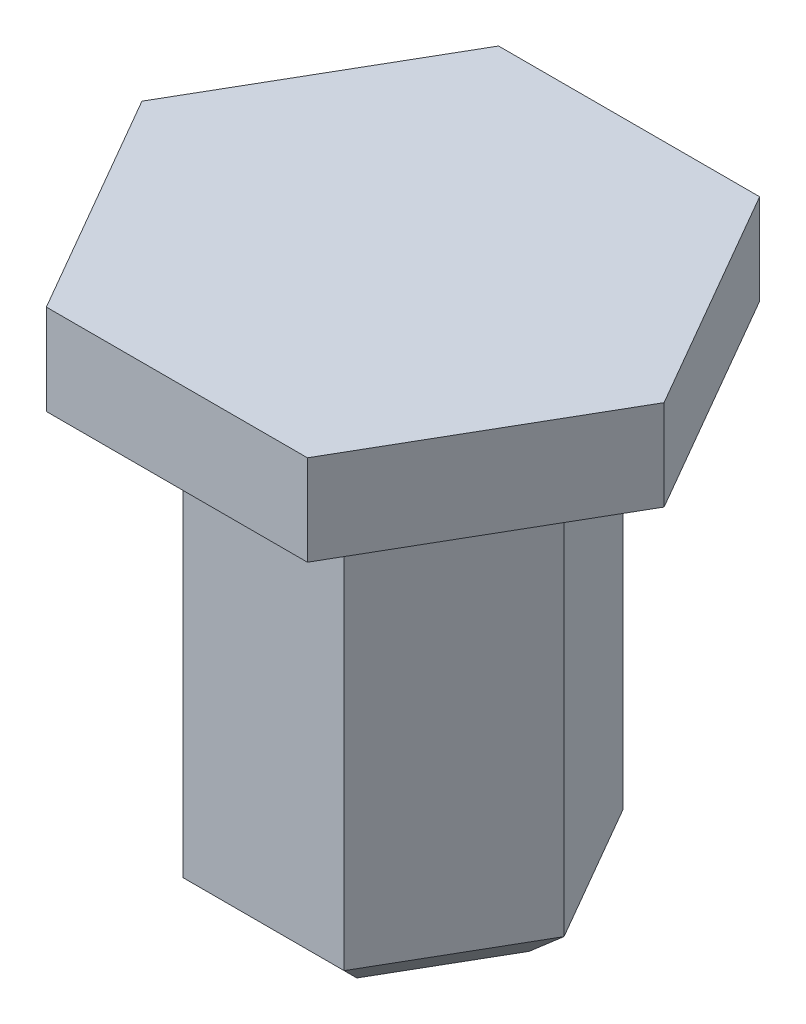
ISO-10303-21;
HEADER;
FILE_DESCRIPTION(('STEP AP214'),'2;1');
FILE_NAME('part.step','',(''),(''),'','','');
FILE_SCHEMA(('AUTOMOTIVE_DESIGN { 1 0 10303 214 1 1 1 1 }'));
ENDSEC;
DATA;
#1=APPLICATION_CONTEXT('core data for automotive mechanical design processes');
#2=APPLICATION_PROTOCOL_DEFINITION('international standard','automotive_design',2000,#1);
#3=PRODUCT_CONTEXT('',#1,'mechanical');
#4=PRODUCT('Part','Part','',(#3));
#5=PRODUCT_RELATED_PRODUCT_CATEGORY('part','',(#4));
#6=PRODUCT_DEFINITION_FORMATION('','',#4);
#7=PRODUCT_DEFINITION_CONTEXT('part definition',#1,'design');
#8=PRODUCT_DEFINITION('design','',#6,#7);
#9=PRODUCT_DEFINITION_SHAPE('','',#8);
#10=(LENGTH_UNIT() NAMED_UNIT(*) SI_UNIT(.MILLI.,.METRE.));
#11=(NAMED_UNIT(*) PLANE_ANGLE_UNIT() SI_UNIT($,.RADIAN.));
#12=(NAMED_UNIT(*) SI_UNIT($,.STERADIAN.) SOLID_ANGLE_UNIT());
#13=UNCERTAINTY_MEASURE_WITH_UNIT(LENGTH_MEASURE(1.E-05),#10,'distance_accuracy_value','');
#14=(GEOMETRIC_REPRESENTATION_CONTEXT(3) GLOBAL_UNCERTAINTY_ASSIGNED_CONTEXT((#13)) GLOBAL_UNIT_ASSIGNED_CONTEXT((#10,
#11,#12)) REPRESENTATION_CONTEXT('',''));
#15=CARTESIAN_POINT('',(0.,0.,0.));
#16=DIRECTION('',(0.,0.,1.));
#17=DIRECTION('',(1.,0.,0.));
#18=AXIS2_PLACEMENT_3D('',#15,#16,#17);
#19=CARTESIAN_POINT('',(1.06809799800083,6.,1.84999999999999));
#20=DIRECTION('',(-0.866025403784442,0.,-0.499999999999995));
#21=DIRECTION('',(-0.499999999999995,0.,0.866025403784442));
#22=AXIS2_PLACEMENT_3D('',#19,#20,#21);
#23=PLANE('',#22);
#24=DIRECTION('',(0.,-1.,0.));
#25=VECTOR('',#24,1.);
#26=CARTESIAN_POINT('',(1.06809799800083,6.,1.84999999999999));
#27=LINE('',#26,#25);
#28=CARTESIAN_POINT('',(1.06809799800083,6.,1.84999999999999));
#29=VERTEX_POINT('',#28);
#30=CARTESIAN_POINT('',(1.06809799800083,0.400000000000001,1.84999999999999));
#31=VERTEX_POINT('',#30);
#32=EDGE_CURVE('E193',#29,#31,#27,.T.);
#33=ORIENTED_EDGE('',*,*,#32,.T.);
#34=DIRECTION('',(0.499999999999995,0.,-0.866025403784442));
#35=VECTOR('',#34,1.);
#36=CARTESIAN_POINT('',(1.06809799800083,0.400000000000001,1.84999999999999));
#37=LINE('',#36,#35);
#38=CARTESIAN_POINT('',(2.13619599600162,0.400000000000001,0.));
#39=VERTEX_POINT('',#38);
#40=EDGE_CURVE('E11',#31,#39,#37,.T.);
#41=ORIENTED_EDGE('',*,*,#40,.T.);
#42=DIRECTION('',(0.,-1.,0.));
#43=VECTOR('',#42,1.);
#44=CARTESIAN_POINT('',(2.13619599600162,6.,0.));
#45=LINE('',#44,#43);
#46=CARTESIAN_POINT('',(2.13619599600162,6.,0.));
#47=VERTEX_POINT('',#46);
#48=EDGE_CURVE('E205',#47,#39,#45,.T.);
#49=ORIENTED_EDGE('',*,*,#48,.F.);
#50=DIRECTION('',(0.499999999999995,0.,-0.866025403784441));
#51=VECTOR('',#50,1.);
#52=CARTESIAN_POINT('',(1.06809799800083,6.,1.84999999999999));
#53=LINE('',#52,#51);
#54=EDGE_CURVE('E170',#29,#47,#53,.T.);
#55=ORIENTED_EDGE('',*,*,#54,.F.);
#56=EDGE_LOOP('',(#33,#41,#49,#55));
#57=FACE_BOUND('',#56,.T.);
#58=ADVANCED_FACE('F35',(#57),#23,.F.);
#59=CARTESIAN_POINT('',(2.13619599600162,6.,0.));
#60=DIRECTION('',(-0.866025403784438,0.,0.500000000000001));
#61=DIRECTION('',(0.500000000000001,0.,0.866025403784438));
#62=AXIS2_PLACEMENT_3D('',#59,#60,#61);
#63=PLANE('',#62);
#64=ORIENTED_EDGE('',*,*,#48,.T.);
#65=DIRECTION('',(-0.500000000000001,0.,-0.866025403784438));
#66=VECTOR('',#65,1.);
#67=CARTESIAN_POINT('',(2.13619599600162,0.400000000000001,0.));
#68=LINE('',#67,#66);
#69=CARTESIAN_POINT('',(1.0680979980008,0.400000000000001,-1.85));
#70=VERTEX_POINT('',#69);
#71=EDGE_CURVE('E208',#39,#70,#68,.T.);
#72=ORIENTED_EDGE('',*,*,#71,.T.);
#73=DIRECTION('',(0.,-1.,0.));
#74=VECTOR('',#73,1.);
#75=CARTESIAN_POINT('',(1.0680979980008,6.,-1.85));
#76=LINE('',#75,#74);
#77=CARTESIAN_POINT('',(1.0680979980008,6.,-1.85));
#78=VERTEX_POINT('',#77);
#79=EDGE_CURVE('E202',#78,#70,#76,.T.);
#80=ORIENTED_EDGE('',*,*,#79,.F.);
#81=DIRECTION('',(-0.500000000000001,0.,-0.866025403784438));
#82=VECTOR('',#81,1.);
#83=CARTESIAN_POINT('',(2.13619599600162,6.,0.));
#84=LINE('',#83,#82);
#85=EDGE_CURVE('E173',#47,#78,#84,.T.);
#86=ORIENTED_EDGE('',*,*,#85,.F.);
#87=EDGE_LOOP('',(#64,#72,#80,#86));
#88=FACE_BOUND('',#87,.T.);
#89=ADVANCED_FACE('F303',(#88),#63,.F.);
#90=CARTESIAN_POINT('',(1.0680979980008,6.,-1.85));
#91=DIRECTION('',(0.,0.,1.));
#92=DIRECTION('',(1.,0.,0.));
#93=AXIS2_PLACEMENT_3D('',#90,#91,#92);
#94=PLANE('',#93);
#95=ORIENTED_EDGE('',*,*,#79,.T.);
#96=DIRECTION('',(-1.,0.,0.));
#97=VECTOR('',#96,1.);
#98=CARTESIAN_POINT('',(1.0680979980008,0.400000000000001,-1.85));
#99=LINE('',#98,#97);
#100=CARTESIAN_POINT('',(-1.06809799800082,0.400000000000001,-1.85));
#101=VERTEX_POINT('',#100);
#102=EDGE_CURVE('E224',#70,#101,#99,.T.);
#103=ORIENTED_EDGE('',*,*,#102,.T.);
#104=DIRECTION('',(0.,-1.,0.));
#105=VECTOR('',#104,1.);
#106=CARTESIAN_POINT('',(-1.06809799800082,6.,-1.85));
#107=LINE('',#106,#105);
#108=CARTESIAN_POINT('',(-1.06809799800082,6.,-1.85));
#109=VERTEX_POINT('',#108);
#110=EDGE_CURVE('E199',#109,#101,#107,.T.);
#111=ORIENTED_EDGE('',*,*,#110,.F.);
#112=DIRECTION('',(-1.,0.,0.));
#113=VECTOR('',#112,1.);
#114=CARTESIAN_POINT('',(1.0680979980008,6.,-1.85));
#115=LINE('',#114,#113);
#116=EDGE_CURVE('E181',#78,#109,#115,.T.);
#117=ORIENTED_EDGE('',*,*,#116,.F.);
#118=EDGE_LOOP('',(#95,#103,#111,#117));
#119=FACE_BOUND('',#118,.T.);
#120=ADVANCED_FACE('F309',(#119),#94,.F.);
#121=CARTESIAN_POINT('',(-1.06809799800082,6.,-1.85));
#122=DIRECTION('',(0.866025403784442,0.,0.499999999999995));
#123=DIRECTION('',(0.499999999999995,0.,-0.866025403784442));
#124=AXIS2_PLACEMENT_3D('',#121,#122,#123);
#125=PLANE('',#124);
#126=ORIENTED_EDGE('',*,*,#110,.T.);
#127=DIRECTION('',(-0.499999999999995,0.,0.866025403784442));
#128=VECTOR('',#127,1.);
#129=CARTESIAN_POINT('',(-1.06809799800082,0.400000000000001,-1.85));
#130=LINE('',#129,#128);
#131=CARTESIAN_POINT('',(-2.13619599600162,0.400000000000001,0.));
#132=VERTEX_POINT('',#131);
#133=EDGE_CURVE('E226',#101,#132,#130,.T.);
#134=ORIENTED_EDGE('',*,*,#133,.T.);
#135=DIRECTION('',(0.,-1.,0.));
#136=VECTOR('',#135,1.);
#137=CARTESIAN_POINT('',(-2.13619599600162,6.,0.));
#138=LINE('',#137,#136);
#139=CARTESIAN_POINT('',(-2.13619599600162,6.,0.));
#140=VERTEX_POINT('',#139);
#141=EDGE_CURVE('E197',#140,#132,#138,.T.);
#142=ORIENTED_EDGE('',*,*,#141,.F.);
#143=DIRECTION('',(-0.499999999999995,0.,0.866025403784441));
#144=VECTOR('',#143,1.);
#145=CARTESIAN_POINT('',(-1.06809799800082,6.,-1.85));
#146=LINE('',#145,#144);
#147=EDGE_CURVE('E184',#109,#140,#146,.T.);
#148=ORIENTED_EDGE('',*,*,#147,.F.);
#149=EDGE_LOOP('',(#126,#134,#142,#148));
#150=FACE_BOUND('',#149,.T.);
#151=ADVANCED_FACE('F372',(#150),#125,.F.);
#152=CARTESIAN_POINT('',(-2.13619599600162,6.,0.));
#153=DIRECTION('',(0.866025403784434,0.,-0.500000000000007));
#154=DIRECTION('',(-0.500000000000007,0.,-0.866025403784435));
#155=AXIS2_PLACEMENT_3D('',#152,#153,#154);
#156=PLANE('',#155);
#157=ORIENTED_EDGE('',*,*,#141,.T.);
#158=DIRECTION('',(0.500000000000007,0.,0.866025403784435));
#159=VECTOR('',#158,1.);
#160=CARTESIAN_POINT('',(-2.13619599600162,0.400000000000001,0.));
#161=LINE('',#160,#159);
#162=CARTESIAN_POINT('',(-1.06809799800079,0.400000000000001,1.85000000000001));
#163=VERTEX_POINT('',#162);
#164=EDGE_CURVE('E60',#132,#163,#161,.T.);
#165=ORIENTED_EDGE('',*,*,#164,.T.);
#166=DIRECTION('',(0.,-1.,0.));
#167=VECTOR('',#166,1.);
#168=CARTESIAN_POINT('',(-1.06809799800079,6.,1.85000000000001));
#169=LINE('',#168,#167);
#170=CARTESIAN_POINT('',(-1.06809799800079,6.,1.85000000000001));
#171=VERTEX_POINT('',#170);
#172=EDGE_CURVE('E195',#171,#163,#169,.T.);
#173=ORIENTED_EDGE('',*,*,#172,.F.);
#174=DIRECTION('',(0.500000000000007,0.,0.866025403784434));
#175=VECTOR('',#174,1.);
#176=CARTESIAN_POINT('',(-2.13619599600162,6.,0.));
#177=LINE('',#176,#175);
#178=EDGE_CURVE('E187',#140,#171,#177,.T.);
#179=ORIENTED_EDGE('',*,*,#178,.F.);
#180=EDGE_LOOP('',(#157,#165,#173,#179));
#181=FACE_BOUND('',#180,.T.);
#182=ADVANCED_FACE('F370',(#181),#156,.F.);
#183=CARTESIAN_POINT('',(-1.06809799800079,6.,1.85000000000001));
#184=DIRECTION('',(0.,0.,-1.));
#185=DIRECTION('',(-1.,0.,0.));
#186=AXIS2_PLACEMENT_3D('',#183,#184,#185);
#187=PLANE('',#186);
#188=ORIENTED_EDGE('',*,*,#172,.T.);
#189=DIRECTION('',(1.,0.,0.));
#190=VECTOR('',#189,1.);
#191=CARTESIAN_POINT('',(-1.06809799800079,0.400000000000001,1.85000000000001));
#192=LINE('',#191,#190);
#193=EDGE_CURVE('E45',#163,#31,#192,.T.);
#194=ORIENTED_EDGE('',*,*,#193,.T.);
#195=ORIENTED_EDGE('',*,*,#32,.F.);
#196=DIRECTION('',(1.,0.,0.));
#197=VECTOR('',#196,1.);
#198=CARTESIAN_POINT('',(-1.06809799800079,6.,1.85000000000001));
#199=LINE('',#198,#197);
#200=EDGE_CURVE('E190',#171,#29,#199,.T.);
#201=ORIENTED_EDGE('',*,*,#200,.F.);
#202=EDGE_LOOP('',(#188,#194,#195,#201));
#203=FACE_BOUND('',#202,.T.);
#204=ADVANCED_FACE('F367',(#203),#187,.F.);
#205=CARTESIAN_POINT('',(0.,0.,0.));
#206=DIRECTION('',(0.,1.,0.));
#207=DIRECTION('',(0.,0.,1.));
#208=AXIS2_PLACEMENT_3D('',#205,#206,#207);
#209=PLANE('',#208);
#210=DIRECTION('',(1.,0.,0.));
#211=VECTOR('',#210,1.);
#212=CARTESIAN_POINT('',(0.,0.,-1.45));
#213=LINE('',#212,#211);
#214=CARTESIAN_POINT('',(-0.837157890324963,0.,-1.44999999999999));
#215=VERTEX_POINT('',#214);
#216=CARTESIAN_POINT('',(0.837157890324953,0.,-1.45));
#217=VERTEX_POINT('',#216);
#218=EDGE_CURVE('E219',#215,#217,#213,.T.);
#219=ORIENTED_EDGE('',*,*,#218,.T.);
#220=DIRECTION('',(0.500000000000001,0.,0.866025403784438));
#221=VECTOR('',#220,1.);
#222=CARTESIAN_POINT('',(1.25573683548743,0.,-0.725));
#223=LINE('',#222,#221);
#224=CARTESIAN_POINT('',(1.67431578064991,0.,0.));
#225=VERTEX_POINT('',#224);
#226=EDGE_CURVE('E221',#217,#225,#223,.T.);
#227=ORIENTED_EDGE('',*,*,#226,.T.);
#228=DIRECTION('',(-0.499999999999995,0.,0.866025403784442));
#229=VECTOR('',#228,1.);
#230=CARTESIAN_POINT('',(1.25573683548744,0.,0.724999999999995));
#231=LINE('',#230,#229);
#232=CARTESIAN_POINT('',(0.837157890324975,0.,1.44999999999999));
#233=VERTEX_POINT('',#232);
#234=EDGE_CURVE('E211',#225,#233,#231,.T.);
#235=ORIENTED_EDGE('',*,*,#234,.T.);
#236=DIRECTION('',(-1.,0.,0.));
#237=VECTOR('',#236,1.);
#238=CARTESIAN_POINT('',(0.,0.,1.45));
#239=LINE('',#238,#237);
#240=CARTESIAN_POINT('',(-0.837157890324943,0.,1.45000000000001));
#241=VERTEX_POINT('',#240);
#242=EDGE_CURVE('E213',#233,#241,#239,.T.);
#243=ORIENTED_EDGE('',*,*,#242,.T.);
#244=DIRECTION('',(-0.500000000000007,0.,-0.866025403784435));
#245=VECTOR('',#244,1.);
#246=CARTESIAN_POINT('',(-1.25573683548743,0.,0.725000000000009));
#247=LINE('',#246,#245);
#248=CARTESIAN_POINT('',(-1.67431578064991,0.,0.));
#249=VERTEX_POINT('',#248);
#250=EDGE_CURVE('E215',#241,#249,#247,.T.);
#251=ORIENTED_EDGE('',*,*,#250,.T.);
#252=DIRECTION('',(0.499999999999995,0.,-0.866025403784442));
#253=VECTOR('',#252,1.);
#254=CARTESIAN_POINT('',(-1.25573683548744,0.,-0.724999999999992));
#255=LINE('',#254,#253);
#256=EDGE_CURVE('E217',#249,#215,#255,.T.);
#257=ORIENTED_EDGE('',*,*,#256,.T.);
#258=EDGE_LOOP('',(#219,#227,#235,#243,#251,#257));
#259=FACE_BOUND('',#258,.T.);
#260=ADVANCED_FACE('F357',(#259),#209,.F.);
#261=CARTESIAN_POINT('',(0.,6.,0.));
#262=DIRECTION('',(0.,1.,0.));
#263=DIRECTION('',(0.,0.,1.));
#264=AXIS2_PLACEMENT_3D('',#261,#262,#263);
#265=PLANE('',#264);
#266=DIRECTION('',(0.5,0.,-0.866025403784438));
#267=VECTOR('',#266,1.);
#268=CARTESIAN_POINT('',(1.73205080756888,6.,3.));
#269=LINE('',#268,#267);
#270=CARTESIAN_POINT('',(1.73205080756888,6.,3.));
#271=VERTEX_POINT('',#270);
#272=CARTESIAN_POINT('',(3.46410161513776,6.,0.));
#273=VERTEX_POINT('',#272);
#274=EDGE_CURVE('E169',#271,#273,#269,.T.);
#275=ORIENTED_EDGE('',*,*,#274,.F.);
#276=DIRECTION('',(1.,0.,0.));
#277=VECTOR('',#276,1.);
#278=CARTESIAN_POINT('',(-1.73205080756888,6.,3.));
#279=LINE('',#278,#277);
#280=CARTESIAN_POINT('',(-1.73205080756888,6.,3.));
#281=VERTEX_POINT('',#280);
#282=EDGE_CURVE('E165',#281,#271,#279,.T.);
#283=ORIENTED_EDGE('',*,*,#282,.F.);
#284=DIRECTION('',(0.5,0.,0.866025403784438));
#285=VECTOR('',#284,1.);
#286=CARTESIAN_POINT('',(-3.46410161513776,6.,0.));
#287=LINE('',#286,#285);
#288=CARTESIAN_POINT('',(-3.46410161513776,6.,0.));
#289=VERTEX_POINT('',#288);
#290=EDGE_CURVE('E259',#289,#281,#287,.T.);
#291=ORIENTED_EDGE('',*,*,#290,.F.);
#292=DIRECTION('',(-0.5,0.,0.866025403784438));
#293=VECTOR('',#292,1.);
#294=CARTESIAN_POINT('',(-1.73205080756888,6.,-3.));
#295=LINE('',#294,#293);
#296=CARTESIAN_POINT('',(-1.73205080756888,6.,-3.));
#297=VERTEX_POINT('',#296);
#298=EDGE_CURVE('E257',#297,#289,#295,.T.);
#299=ORIENTED_EDGE('',*,*,#298,.F.);
#300=DIRECTION('',(-1.,0.,0.));
#301=VECTOR('',#300,1.);
#302=CARTESIAN_POINT('',(1.73205080756888,6.,-3.));
#303=LINE('',#302,#301);
#304=CARTESIAN_POINT('',(1.73205080756888,6.,-3.));
#305=VERTEX_POINT('',#304);
#306=EDGE_CURVE('E251',#305,#297,#303,.T.);
#307=ORIENTED_EDGE('',*,*,#306,.F.);
#308=DIRECTION('',(-0.5,0.,-0.866025403784438));
#309=VECTOR('',#308,1.);
#310=CARTESIAN_POINT('',(3.46410161513776,6.,0.));
#311=LINE('',#310,#309);
#312=EDGE_CURVE('E249',#273,#305,#311,.T.);
#313=ORIENTED_EDGE('',*,*,#312,.F.);
#314=EDGE_LOOP('',(#275,#283,#291,#299,#307,#313));
#315=FACE_BOUND('',#314,.T.);
#316=ORIENTED_EDGE('',*,*,#200,.T.);
#317=ORIENTED_EDGE('',*,*,#54,.T.);
#318=ORIENTED_EDGE('',*,*,#85,.T.);
#319=ORIENTED_EDGE('',*,*,#116,.T.);
#320=ORIENTED_EDGE('',*,*,#147,.T.);
#321=ORIENTED_EDGE('',*,*,#178,.T.);
#322=EDGE_LOOP('',(#316,#317,#318,#319,#320,#321));
#323=FACE_BOUND('',#322,.T.);
#324=ADVANCED_FACE('F281',(#315,#323),#265,.F.);
#325=CARTESIAN_POINT('',(1.73205080756888,7.2,3.));
#326=DIRECTION('',(-0.866025403784439,0.,-0.5));
#327=DIRECTION('',(-0.5,0.,0.866025403784439));
#328=AXIS2_PLACEMENT_3D('',#325,#326,#327);
#329=PLANE('',#328);
#330=ORIENTED_EDGE('',*,*,#274,.T.);
#331=DIRECTION('',(0.,-1.,0.));
#332=VECTOR('',#331,1.);
#333=CARTESIAN_POINT('',(3.46410161513776,7.2,0.));
#334=LINE('',#333,#332);
#335=CARTESIAN_POINT('',(3.46410161513776,7.2,0.));
#336=VERTEX_POINT('',#335);
#337=EDGE_CURVE('E149',#336,#273,#334,.T.);
#338=ORIENTED_EDGE('',*,*,#337,.F.);
#339=DIRECTION('',(0.5,0.,-0.866025403784438));
#340=VECTOR('',#339,1.);
#341=CARTESIAN_POINT('',(1.73205080756888,7.2,3.));
#342=LINE('',#341,#340);
#343=CARTESIAN_POINT('',(1.73205080756888,7.2,3.));
#344=VERTEX_POINT('',#343);
#345=EDGE_CURVE('E156',#344,#336,#342,.T.);
#346=ORIENTED_EDGE('',*,*,#345,.F.);
#347=DIRECTION('',(0.,-1.,0.));
#348=VECTOR('',#347,1.);
#349=CARTESIAN_POINT('',(1.73205080756888,7.2,3.));
#350=LINE('',#349,#348);
#351=EDGE_CURVE('E262',#344,#271,#350,.T.);
#352=ORIENTED_EDGE('',*,*,#351,.T.);
#353=EDGE_LOOP('',(#330,#338,#346,#352));
#354=FACE_BOUND('',#353,.T.);
#355=ADVANCED_FACE('F167',(#354),#329,.F.);
#356=CARTESIAN_POINT('',(3.46410161513776,7.2,0.));
#357=DIRECTION('',(-0.866025403784438,0.,0.5));
#358=DIRECTION('',(0.5,0.,0.866025403784439));
#359=AXIS2_PLACEMENT_3D('',#356,#357,#358);
#360=PLANE('',#359);
#361=ORIENTED_EDGE('',*,*,#312,.T.);
#362=DIRECTION('',(0.,-1.,0.));
#363=VECTOR('',#362,1.);
#364=CARTESIAN_POINT('',(1.73205080756888,7.2,-3.));
#365=LINE('',#364,#363);
#366=CARTESIAN_POINT('',(1.73205080756888,7.2,-3.));
#367=VERTEX_POINT('',#366);
#368=EDGE_CURVE('E152',#367,#305,#365,.T.);
#369=ORIENTED_EDGE('',*,*,#368,.F.);
#370=DIRECTION('',(-0.5,0.,-0.866025403784438));
#371=VECTOR('',#370,1.);
#372=CARTESIAN_POINT('',(3.46410161513776,7.2,0.));
#373=LINE('',#372,#371);
#374=EDGE_CURVE('E145',#336,#367,#373,.T.);
#375=ORIENTED_EDGE('',*,*,#374,.F.);
#376=ORIENTED_EDGE('',*,*,#337,.T.);
#377=EDGE_LOOP('',(#361,#369,#375,#376));
#378=FACE_BOUND('',#377,.T.);
#379=ADVANCED_FACE('F147',(#378),#360,.F.);
#380=CARTESIAN_POINT('',(1.73205080756888,7.2,-3.));
#381=DIRECTION('',(0.,0.,1.));
#382=DIRECTION('',(1.,0.,0.));
#383=AXIS2_PLACEMENT_3D('',#380,#381,#382);
#384=PLANE('',#383);
#385=ORIENTED_EDGE('',*,*,#306,.T.);
#386=DIRECTION('',(0.,-1.,0.));
#387=VECTOR('',#386,1.);
#388=CARTESIAN_POINT('',(-1.73205080756888,7.2,-3.));
#389=LINE('',#388,#387);
#390=CARTESIAN_POINT('',(-1.73205080756888,7.2,-3.));
#391=VERTEX_POINT('',#390);
#392=EDGE_CURVE('E175',#391,#297,#389,.T.);
#393=ORIENTED_EDGE('',*,*,#392,.F.);
#394=DIRECTION('',(-1.,0.,0.));
#395=VECTOR('',#394,1.);
#396=CARTESIAN_POINT('',(1.73205080756888,7.2,-3.));
#397=LINE('',#396,#395);
#398=EDGE_CURVE('E155',#367,#391,#397,.T.);
#399=ORIENTED_EDGE('',*,*,#398,.F.);
#400=ORIENTED_EDGE('',*,*,#368,.T.);
#401=EDGE_LOOP('',(#385,#393,#399,#400));
#402=FACE_BOUND('',#401,.T.);
#403=ADVANCED_FACE('F293',(#402),#384,.F.);
#404=CARTESIAN_POINT('',(-1.73205080756888,7.2,-3.));
#405=DIRECTION('',(0.866025403784438,0.,0.5));
#406=DIRECTION('',(0.5,0.,-0.866025403784439));
#407=AXIS2_PLACEMENT_3D('',#404,#405,#406);
#408=PLANE('',#407);
#409=ORIENTED_EDGE('',*,*,#298,.T.);
#410=DIRECTION('',(0.,-1.,0.));
#411=VECTOR('',#410,1.);
#412=CARTESIAN_POINT('',(-3.46410161513776,7.2,0.));
#413=LINE('',#412,#411);
#414=CARTESIAN_POINT('',(-3.46410161513776,7.2,0.));
#415=VERTEX_POINT('',#414);
#416=EDGE_CURVE('E267',#415,#289,#413,.T.);
#417=ORIENTED_EDGE('',*,*,#416,.F.);
#418=DIRECTION('',(-0.5,0.,0.866025403784438));
#419=VECTOR('',#418,1.);
#420=CARTESIAN_POINT('',(-1.73205080756888,7.2,-3.));
#421=LINE('',#420,#419);
#422=EDGE_CURVE('E276',#391,#415,#421,.T.);
#423=ORIENTED_EDGE('',*,*,#422,.F.);
#424=ORIENTED_EDGE('',*,*,#392,.T.);
#425=EDGE_LOOP('',(#409,#417,#423,#424));
#426=FACE_BOUND('',#425,.T.);
#427=ADVANCED_FACE('F274',(#426),#408,.F.);
#428=CARTESIAN_POINT('',(-3.46410161513776,7.2,0.));
#429=DIRECTION('',(0.866025403784438,0.,-0.5));
#430=DIRECTION('',(-0.5,0.,-0.866025403784439));
#431=AXIS2_PLACEMENT_3D('',#428,#429,#430);
#432=PLANE('',#431);
#433=ORIENTED_EDGE('',*,*,#290,.T.);
#434=DIRECTION('',(0.,-1.,0.));
#435=VECTOR('',#434,1.);
#436=CARTESIAN_POINT('',(-1.73205080756888,7.2,3.));
#437=LINE('',#436,#435);
#438=CARTESIAN_POINT('',(-1.73205080756888,7.2,3.));
#439=VERTEX_POINT('',#438);
#440=EDGE_CURVE('E264',#439,#281,#437,.T.);
#441=ORIENTED_EDGE('',*,*,#440,.F.);
#442=DIRECTION('',(0.5,0.,0.866025403784438));
#443=VECTOR('',#442,1.);
#444=CARTESIAN_POINT('',(-3.46410161513776,7.2,0.));
#445=LINE('',#444,#443);
#446=EDGE_CURVE('E290',#415,#439,#445,.T.);
#447=ORIENTED_EDGE('',*,*,#446,.F.);
#448=ORIENTED_EDGE('',*,*,#416,.T.);
#449=EDGE_LOOP('',(#433,#441,#447,#448));
#450=FACE_BOUND('',#449,.T.);
#451=ADVANCED_FACE('F286',(#450),#432,.F.);
#452=CARTESIAN_POINT('',(-1.73205080756888,7.2,3.));
#453=DIRECTION('',(0.,0.,-1.));
#454=DIRECTION('',(-1.,0.,0.));
#455=AXIS2_PLACEMENT_3D('',#452,#453,#454);
#456=PLANE('',#455);
#457=ORIENTED_EDGE('',*,*,#282,.T.);
#458=ORIENTED_EDGE('',*,*,#351,.F.);
#459=DIRECTION('',(1.,0.,0.));
#460=VECTOR('',#459,1.);
#461=CARTESIAN_POINT('',(-1.73205080756888,7.2,3.));
#462=LINE('',#461,#460);
#463=EDGE_CURVE('E161',#439,#344,#462,.T.);
#464=ORIENTED_EDGE('',*,*,#463,.F.);
#465=ORIENTED_EDGE('',*,*,#440,.T.);
#466=EDGE_LOOP('',(#457,#458,#464,#465));
#467=FACE_BOUND('',#466,.T.);
#468=ADVANCED_FACE('F289',(#467),#456,.F.);
#469=CARTESIAN_POINT('',(0.,7.2,0.));
#470=DIRECTION('',(0.,1.,0.));
#471=DIRECTION('',(0.,0.,1.));
#472=AXIS2_PLACEMENT_3D('',#469,#470,#471);
#473=PLANE('',#472);
#474=ORIENTED_EDGE('',*,*,#345,.T.);
#475=ORIENTED_EDGE('',*,*,#374,.T.);
#476=ORIENTED_EDGE('',*,*,#398,.T.);
#477=ORIENTED_EDGE('',*,*,#422,.T.);
#478=ORIENTED_EDGE('',*,*,#446,.T.);
#479=ORIENTED_EDGE('',*,*,#463,.T.);
#480=EDGE_LOOP('',(#474,#475,#476,#477,#478,#479));
#481=FACE_BOUND('',#480,.T.);
#482=ADVANCED_FACE('F159',(#481),#473,.T.);
#483=CARTESIAN_POINT('',(-2.13619599600162,0.400000000000001,0.));
#484=DIRECTION('',(0.61237243569579,0.707106781186549,-0.353553390593278));
#485=DIRECTION('',(0.500000000000007,0.,0.866025403784435));
#486=AXIS2_PLACEMENT_3D('',#483,#484,#485);
#487=PLANE('',#486);
#488=DIRECTION('',(0.755928946018456,-0.654653670707976,0.));
#489=VECTOR('',#488,1.);
#490=CARTESIAN_POINT('',(-2.13619599600162,0.400000000000001,0.));
#491=LINE('',#490,#489);
#492=EDGE_CURVE('E239',#249,#132,#491,.F.);
#493=ORIENTED_EDGE('',*,*,#492,.F.);
#494=ORIENTED_EDGE('',*,*,#250,.F.);
#495=DIRECTION('',(0.377964473009222,-0.654653670707976,-0.654653670707982));
#496=VECTOR('',#495,1.);
#497=CARTESIAN_POINT('',(-1.06809799800079,0.400000000000001,1.85000000000001));
#498=LINE('',#497,#496);
#499=EDGE_CURVE('E40',#163,#241,#498,.T.);
#500=ORIENTED_EDGE('',*,*,#499,.F.);
#501=ORIENTED_EDGE('',*,*,#164,.F.);
#502=EDGE_LOOP('',(#493,#494,#500,#501));
#503=FACE_BOUND('',#502,.T.);
#504=ADVANCED_FACE('F38',(#503),#487,.F.);
#505=CARTESIAN_POINT('',(-1.06809799800079,0.400000000000001,1.85000000000001));
#506=DIRECTION('',(0.,0.707106781186549,-0.707106781186546));
#507=DIRECTION('',(1.,0.,0.));
#508=AXIS2_PLACEMENT_3D('',#505,#506,#507);
#509=PLANE('',#508);
#510=ORIENTED_EDGE('',*,*,#499,.T.);
#511=ORIENTED_EDGE('',*,*,#242,.F.);
#512=DIRECTION('',(-0.377964473009233,-0.654653670707976,-0.654653670707975));
#513=VECTOR('',#512,1.);
#514=CARTESIAN_POINT('',(1.06809799800083,0.400000000000001,1.84999999999999));
#515=LINE('',#514,#513);
#516=EDGE_CURVE('E237',#31,#233,#515,.T.);
#517=ORIENTED_EDGE('',*,*,#516,.F.);
#518=ORIENTED_EDGE('',*,*,#193,.F.);
#519=EDGE_LOOP('',(#510,#511,#517,#518));
#520=FACE_BOUND('',#519,.T.);
#521=ADVANCED_FACE('F341',(#520),#509,.F.);
#522=CARTESIAN_POINT('',(-1.06809799800082,0.400000000000001,-1.85));
#523=DIRECTION('',(0.612372435695796,0.707106781186549,0.35355339059327));
#524=DIRECTION('',(-0.499999999999995,0.,0.866025403784442));
#525=AXIS2_PLACEMENT_3D('',#522,#523,#524);
#526=PLANE('',#525);
#527=ORIENTED_EDGE('',*,*,#492,.T.);
#528=ORIENTED_EDGE('',*,*,#133,.F.);
#529=DIRECTION('',(0.377964473009231,-0.654653670707976,0.654653670707977));
#530=VECTOR('',#529,1.);
#531=CARTESIAN_POINT('',(-1.06809799800082,0.400000000000001,-1.85));
#532=LINE('',#531,#530);
#533=EDGE_CURVE('E234',#215,#101,#532,.F.);
#534=ORIENTED_EDGE('',*,*,#533,.F.);
#535=ORIENTED_EDGE('',*,*,#256,.F.);
#536=EDGE_LOOP('',(#527,#528,#534,#535));
#537=FACE_BOUND('',#536,.T.);
#538=ADVANCED_FACE('F335',(#537),#526,.F.);
#539=CARTESIAN_POINT('',(1.06809799800083,0.400000000000001,1.84999999999999));
#540=DIRECTION('',(-0.612372435695796,0.707106781186549,-0.35355339059327));
#541=DIRECTION('',(0.499999999999995,0.,-0.866025403784442));
#542=AXIS2_PLACEMENT_3D('',#539,#540,#541);
#543=PLANE('',#542);
#544=ORIENTED_EDGE('',*,*,#516,.T.);
#545=ORIENTED_EDGE('',*,*,#234,.F.);
#546=DIRECTION('',(0.755928946018455,0.654653670707976,0.));
#547=VECTOR('',#546,1.);
#548=CARTESIAN_POINT('',(1.5258542828583,-0.128571428571421,0.));
#549=LINE('',#548,#547);
#550=EDGE_CURVE('E232',#39,#225,#549,.F.);
#551=ORIENTED_EDGE('',*,*,#550,.F.);
#552=ORIENTED_EDGE('',*,*,#40,.F.);
#553=EDGE_LOOP('',(#544,#545,#551,#552));
#554=FACE_BOUND('',#553,.T.);
#555=ADVANCED_FACE('F328',(#554),#543,.F.);
#556=CARTESIAN_POINT('',(1.0680979980008,0.400000000000001,-1.85));
#557=DIRECTION('',(0.,0.707106781186549,0.707106781186546));
#558=DIRECTION('',(-1.,0.,0.));
#559=AXIS2_PLACEMENT_3D('',#556,#557,#558);
#560=PLANE('',#559);
#561=ORIENTED_EDGE('',*,*,#533,.T.);
#562=ORIENTED_EDGE('',*,*,#102,.F.);
#563=DIRECTION('',(-0.377964473009227,-0.654653670707975,0.654653670707979));
#564=VECTOR('',#563,1.);
#565=CARTESIAN_POINT('',(1.0680979980008,0.400000000000001,-1.85));
#566=LINE('',#565,#564);
#567=EDGE_CURVE('E230',#217,#70,#566,.F.);
#568=ORIENTED_EDGE('',*,*,#567,.F.);
#569=ORIENTED_EDGE('',*,*,#218,.F.);
#570=EDGE_LOOP('',(#561,#562,#568,#569));
#571=FACE_BOUND('',#570,.T.);
#572=ADVANCED_FACE('F321',(#571),#560,.F.);
#573=CARTESIAN_POINT('',(2.13619599600162,0.400000000000001,0.));
#574=DIRECTION('',(-0.612372435695793,0.707106781186549,0.353553390593274));
#575=DIRECTION('',(-0.500000000000001,0.,-0.866025403784438));
#576=AXIS2_PLACEMENT_3D('',#573,#574,#575);
#577=PLANE('',#576);
#578=ORIENTED_EDGE('',*,*,#550,.T.);
#579=ORIENTED_EDGE('',*,*,#226,.F.);
#580=ORIENTED_EDGE('',*,*,#567,.T.);
#581=ORIENTED_EDGE('',*,*,#71,.F.);
#582=EDGE_LOOP('',(#578,#579,#580,#581));
#583=FACE_BOUND('',#582,.T.);
#584=ADVANCED_FACE('F315',(#583),#577,.F.);
#585=CLOSED_SHELL('',(#58,#89,#120,#151,#182,#204,#260,#324,#355,#379,#403,#427,#451,#468,#482,
#504,#521,#538,#555,#572,#584));
#586=MANIFOLD_SOLID_BREP('B2',#585);
#587=ADVANCED_BREP_SHAPE_REPRESENTATION('',(#18,#586),#14);
#588=SHAPE_DEFINITION_REPRESENTATION(#9,#587);
ENDSEC;
END-ISO-10303-21;
